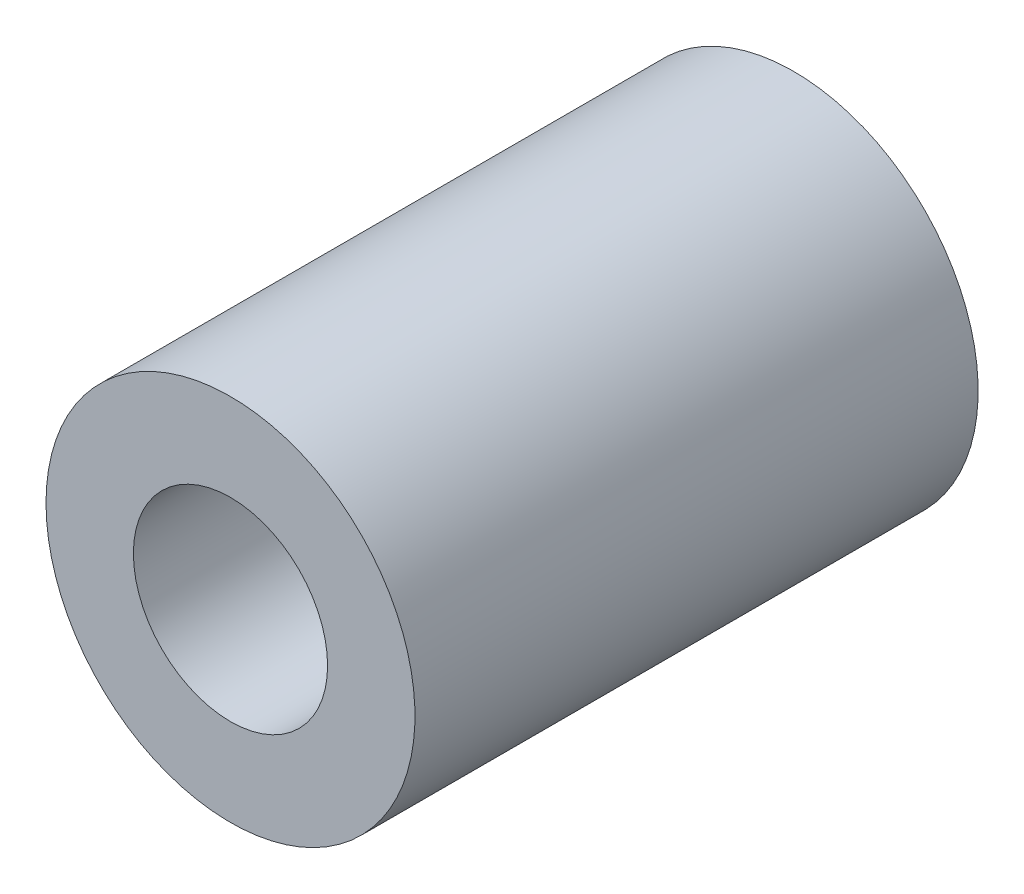
ISO-10303-21;
HEADER;
FILE_DESCRIPTION(('STEP AP214'),'2;1');
FILE_NAME('part.step','',(''),(''),'','','');
FILE_SCHEMA(('AUTOMOTIVE_DESIGN { 1 0 10303 214 1 1 1 1 }'));
ENDSEC;
DATA;
#1=APPLICATION_CONTEXT('core data for automotive mechanical design processes');
#2=APPLICATION_PROTOCOL_DEFINITION('international standard','automotive_design',2000,#1);
#3=PRODUCT_CONTEXT('',#1,'mechanical');
#4=PRODUCT('Part','Part','',(#3));
#5=PRODUCT_RELATED_PRODUCT_CATEGORY('part','',(#4));
#6=PRODUCT_DEFINITION_FORMATION('','',#4);
#7=PRODUCT_DEFINITION_CONTEXT('part definition',#1,'design');
#8=PRODUCT_DEFINITION('design','',#6,#7);
#9=PRODUCT_DEFINITION_SHAPE('','',#8);
#10=(LENGTH_UNIT() NAMED_UNIT(*) SI_UNIT(.MILLI.,.METRE.));
#11=(NAMED_UNIT(*) PLANE_ANGLE_UNIT() SI_UNIT($,.RADIAN.));
#12=(NAMED_UNIT(*) SI_UNIT($,.STERADIAN.) SOLID_ANGLE_UNIT());
#13=UNCERTAINTY_MEASURE_WITH_UNIT(LENGTH_MEASURE(1.E-05),#10,'distance_accuracy_value','');
#14=(GEOMETRIC_REPRESENTATION_CONTEXT(3) GLOBAL_UNCERTAINTY_ASSIGNED_CONTEXT((#13)) GLOBAL_UNIT_ASSIGNED_CONTEXT((#10,
#11,#12)) REPRESENTATION_CONTEXT('',''));
#15=CARTESIAN_POINT('',(0.,0.,0.));
#16=DIRECTION('',(0.,0.,1.));
#17=DIRECTION('',(1.,0.,0.));
#18=AXIS2_PLACEMENT_3D('',#15,#16,#17);
#19=CARTESIAN_POINT('',(0.,0.,29.));
#20=DIRECTION('',(0.,0.,1.));
#21=DIRECTION('',(1.,0.,0.));
#22=AXIS2_PLACEMENT_3D('',#19,#20,#21);
#23=PLANE('',#22);
#24=CARTESIAN_POINT('',(0.,0.,29.));
#25=DIRECTION('',(0.,0.,1.));
#26=DIRECTION('',(1.,0.,0.));
#27=AXIS2_PLACEMENT_3D('',#24,#25,#26);
#28=CIRCLE('',#27,9.5);
#29=CARTESIAN_POINT('',(-9.5,0.,29.));
#30=VERTEX_POINT('',#29);
#31=EDGE_CURVE('E10',#30,#30,#28,.T.);
#32=ORIENTED_EDGE('',*,*,#31,.T.);
#33=EDGE_LOOP('',(#32));
#34=FACE_BOUND('',#33,.T.);
#35=CARTESIAN_POINT('',(0.,0.,29.));
#36=DIRECTION('',(0.,0.,1.));
#37=DIRECTION('',(1.,0.,0.));
#38=AXIS2_PLACEMENT_3D('',#35,#36,#37);
#39=CIRCLE('',#38,5.);
#40=CARTESIAN_POINT('',(-5.,0.,29.));
#41=VERTEX_POINT('',#40);
#42=EDGE_CURVE('E44',#41,#41,#39,.T.);
#43=ORIENTED_EDGE('',*,*,#42,.F.);
#44=EDGE_LOOP('',(#43));
#45=FACE_BOUND('',#44,.T.);
#46=ADVANCED_FACE('F33',(#34,#45),#23,.T.);
#47=CARTESIAN_POINT('',(0.,0.,0.));
#48=DIRECTION('',(0.,0.,1.));
#49=DIRECTION('',(1.,0.,0.));
#50=AXIS2_PLACEMENT_3D('',#47,#48,#49);
#51=PLANE('',#50);
#52=CARTESIAN_POINT('',(0.,0.,0.));
#53=DIRECTION('',(0.,0.,1.));
#54=DIRECTION('',(1.,0.,0.));
#55=AXIS2_PLACEMENT_3D('',#52,#53,#54);
#56=CIRCLE('',#55,9.5);
#57=CARTESIAN_POINT('',(-9.5,0.,0.));
#58=VERTEX_POINT('',#57);
#59=EDGE_CURVE('E37',#58,#58,#56,.T.);
#60=ORIENTED_EDGE('',*,*,#59,.F.);
#61=EDGE_LOOP('',(#60));
#62=FACE_BOUND('',#61,.T.);
#63=CARTESIAN_POINT('',(0.,0.,0.));
#64=DIRECTION('',(0.,0.,1.));
#65=DIRECTION('',(1.,0.,0.));
#66=AXIS2_PLACEMENT_3D('',#63,#64,#65);
#67=CIRCLE('',#66,5.);
#68=CARTESIAN_POINT('',(-5.,0.,0.));
#69=VERTEX_POINT('',#68);
#70=EDGE_CURVE('E46',#69,#69,#67,.T.);
#71=ORIENTED_EDGE('',*,*,#70,.T.);
#72=EDGE_LOOP('',(#71));
#73=FACE_BOUND('',#72,.T.);
#74=ADVANCED_FACE('F56',(#62,#73),#51,.F.);
#75=CARTESIAN_POINT('',(0.,0.,29.));
#76=DIRECTION('',(0.,0.,-1.));
#77=DIRECTION('',(-1.,0.,0.));
#78=AXIS2_PLACEMENT_3D('',#75,#76,#77);
#79=CYLINDRICAL_SURFACE('',#78,9.5);
#80=CARTESIAN_POINT('',(-9.5,0.,29.));
#81=CARTESIAN_POINT('',(-9.5,0.,28.6979166666667));
#82=CARTESIAN_POINT('',(-9.5,0.,28.3958333333333));
#83=CARTESIAN_POINT('',(-9.5,0.,27.7916666666667));
#84=CARTESIAN_POINT('',(-9.5,0.,27.4895833333333));
#85=CARTESIAN_POINT('',(-9.5,0.,26.8854166666667));
#86=CARTESIAN_POINT('',(-9.5,0.,26.5833333333333));
#87=CARTESIAN_POINT('',(-9.5,0.,25.9791666666667));
#88=CARTESIAN_POINT('',(-9.5,0.,25.6770833333333));
#89=CARTESIAN_POINT('',(-9.5,0.,25.0729166666667));
#90=CARTESIAN_POINT('',(-9.5,0.,24.7708333333333));
#91=CARTESIAN_POINT('',(-9.5,0.,24.1666666666667));
#92=CARTESIAN_POINT('',(-9.5,0.,23.8645833333333));
#93=CARTESIAN_POINT('',(-9.5,0.,23.2604166666667));
#94=CARTESIAN_POINT('',(-9.5,0.,22.9583333333333));
#95=CARTESIAN_POINT('',(-9.5,0.,22.3541666666667));
#96=CARTESIAN_POINT('',(-9.5,0.,22.0520833333333));
#97=CARTESIAN_POINT('',(-9.5,0.,21.4479166666667));
#98=CARTESIAN_POINT('',(-9.5,0.,21.1458333333333));
#99=CARTESIAN_POINT('',(-9.5,0.,20.5416666666667));
#100=CARTESIAN_POINT('',(-9.5,0.,20.2395833333333));
#101=CARTESIAN_POINT('',(-9.5,0.,19.6354166666667));
#102=CARTESIAN_POINT('',(-9.5,0.,19.3333333333333));
#103=CARTESIAN_POINT('',(-9.5,0.,18.7291666666667));
#104=CARTESIAN_POINT('',(-9.5,0.,18.4270833333333));
#105=CARTESIAN_POINT('',(-9.5,0.,17.8229166666667));
#106=CARTESIAN_POINT('',(-9.5,0.,17.5208333333333));
#107=CARTESIAN_POINT('',(-9.5,0.,16.9166666666667));
#108=CARTESIAN_POINT('',(-9.5,0.,16.6145833333333));
#109=CARTESIAN_POINT('',(-9.5,0.,16.0104166666667));
#110=CARTESIAN_POINT('',(-9.5,0.,15.7083333333333));
#111=CARTESIAN_POINT('',(-9.5,0.,15.1041666666667));
#112=CARTESIAN_POINT('',(-9.5,0.,14.8020833333333));
#113=CARTESIAN_POINT('',(-9.5,0.,14.1979166666667));
#114=CARTESIAN_POINT('',(-9.5,0.,13.8958333333333));
#115=CARTESIAN_POINT('',(-9.5,0.,13.2916666666667));
#116=CARTESIAN_POINT('',(-9.5,0.,12.9895833333333));
#117=CARTESIAN_POINT('',(-9.5,0.,12.3854166666667));
#118=CARTESIAN_POINT('',(-9.5,0.,12.0833333333333));
#119=CARTESIAN_POINT('',(-9.5,0.,11.4791666666667));
#120=CARTESIAN_POINT('',(-9.5,0.,11.1770833333333));
#121=CARTESIAN_POINT('',(-9.5,0.,10.5729166666667));
#122=CARTESIAN_POINT('',(-9.5,0.,10.2708333333333));
#123=CARTESIAN_POINT('',(-9.5,0.,9.66666666666667));
#124=CARTESIAN_POINT('',(-9.5,0.,9.36458333333333));
#125=CARTESIAN_POINT('',(-9.5,0.,8.76041666666667));
#126=CARTESIAN_POINT('',(-9.5,0.,8.45833333333333));
#127=CARTESIAN_POINT('',(-9.5,0.,7.85416666666667));
#128=CARTESIAN_POINT('',(-9.5,0.,7.55208333333333));
#129=CARTESIAN_POINT('',(-9.5,0.,6.94791666666667));
#130=CARTESIAN_POINT('',(-9.5,0.,6.64583333333333));
#131=CARTESIAN_POINT('',(-9.5,0.,6.04166666666667));
#132=CARTESIAN_POINT('',(-9.5,0.,5.73958333333333));
#133=CARTESIAN_POINT('',(-9.5,0.,5.13541666666667));
#134=CARTESIAN_POINT('',(-9.5,0.,4.83333333333333));
#135=CARTESIAN_POINT('',(-9.5,0.,4.22916666666667));
#136=CARTESIAN_POINT('',(-9.5,0.,3.92708333333333));
#137=CARTESIAN_POINT('',(-9.5,0.,3.32291666666667));
#138=CARTESIAN_POINT('',(-9.5,0.,3.02083333333333));
#139=CARTESIAN_POINT('',(-9.5,0.,2.41666666666667));
#140=CARTESIAN_POINT('',(-9.5,0.,2.11458333333333));
#141=CARTESIAN_POINT('',(-9.5,0.,1.51041666666667));
#142=CARTESIAN_POINT('',(-9.5,0.,1.20833333333333));
#143=CARTESIAN_POINT('',(-9.5,0.,0.604166666666667));
#144=CARTESIAN_POINT('',(-9.5,0.,0.302083333333333));
#145=CARTESIAN_POINT('',(-9.5,0.,0.));
#146=B_SPLINE_CURVE_WITH_KNOTS('',3,(#80,#81,#82,#83,#84,#85,#86,#87,#88,#89,#90,#91,#92,#93,
#94,#95,#96,#97,#98,#99,#100,#101,#102,#103,#104,#105,#106,#107,#108,#109,#110,#111,#112,#113,
#114,#115,#116,#117,#118,#119,#120,#121,#122,#123,#124,#125,#126,#127,#128,#129,#130,#131,#132,
#133,#134,#135,#136,#137,#138,#139,#140,#141,#142,#143,#144,#145),.UNSPECIFIED.,.F.,.F.,(4,2,2,
2,2,2,2,2,2,2,2,2,2,2,2,2,2,2,2,2,2,2,2,2,2,2,2,2,2,2,2,2,4),(0.,0.906250000000001,1.8125,
2.71875,3.625,4.53125,5.4375,6.34375,7.25,8.15625,9.0625,9.96875,10.875,11.78125,12.6875,
13.59375,14.5,15.40625,16.3125,17.21875,18.125,19.03125,19.9375,20.84375,21.75,22.65625,23.5625,
24.46875,25.375,26.28125,27.1875,28.09375,29.),.UNSPECIFIED.);
#147=EDGE_CURVE('BSEAM35',#30,#58,#146,.T.);
#148=ORIENTED_EDGE('',*,*,#31,.F.);
#149=ORIENTED_EDGE('',*,*,#59,.T.);
#150=ORIENTED_EDGE('',*,*,#147,.T.);
#151=ORIENTED_EDGE('',*,*,#147,.F.);
#152=EDGE_LOOP('',(#148,#150,#149,#151));
#153=FACE_BOUND('',#152,.T.);
#154=ADVANCED_FACE('F35',(#153),#79,.T.);
#155=CARTESIAN_POINT('',(0.,0.,29.));
#156=DIRECTION('',(0.,0.,-1.));
#157=DIRECTION('',(-1.,0.,0.));
#158=AXIS2_PLACEMENT_3D('',#155,#156,#157);
#159=CYLINDRICAL_SURFACE('',#158,5.);
#160=CARTESIAN_POINT('',(-5.,0.,29.));
#161=CARTESIAN_POINT('',(-5.,0.,28.6979166666667));
#162=CARTESIAN_POINT('',(-5.,0.,28.3958333333333));
#163=CARTESIAN_POINT('',(-5.,0.,27.7916666666667));
#164=CARTESIAN_POINT('',(-5.,0.,27.4895833333333));
#165=CARTESIAN_POINT('',(-5.,0.,26.8854166666667));
#166=CARTESIAN_POINT('',(-5.,0.,26.5833333333333));
#167=CARTESIAN_POINT('',(-5.,0.,25.9791666666667));
#168=CARTESIAN_POINT('',(-5.,0.,25.6770833333333));
#169=CARTESIAN_POINT('',(-5.,0.,25.0729166666667));
#170=CARTESIAN_POINT('',(-5.,0.,24.7708333333333));
#171=CARTESIAN_POINT('',(-5.,0.,24.1666666666667));
#172=CARTESIAN_POINT('',(-5.,0.,23.8645833333333));
#173=CARTESIAN_POINT('',(-5.,0.,23.2604166666667));
#174=CARTESIAN_POINT('',(-5.,0.,22.9583333333333));
#175=CARTESIAN_POINT('',(-5.,0.,22.3541666666667));
#176=CARTESIAN_POINT('',(-5.,0.,22.0520833333333));
#177=CARTESIAN_POINT('',(-5.,0.,21.4479166666667));
#178=CARTESIAN_POINT('',(-5.,0.,21.1458333333333));
#179=CARTESIAN_POINT('',(-5.,0.,20.5416666666667));
#180=CARTESIAN_POINT('',(-5.,0.,20.2395833333333));
#181=CARTESIAN_POINT('',(-5.,0.,19.6354166666667));
#182=CARTESIAN_POINT('',(-5.,0.,19.3333333333333));
#183=CARTESIAN_POINT('',(-5.,0.,18.7291666666667));
#184=CARTESIAN_POINT('',(-5.,0.,18.4270833333333));
#185=CARTESIAN_POINT('',(-5.,0.,17.8229166666667));
#186=CARTESIAN_POINT('',(-5.,0.,17.5208333333333));
#187=CARTESIAN_POINT('',(-5.,0.,16.9166666666667));
#188=CARTESIAN_POINT('',(-5.,0.,16.6145833333333));
#189=CARTESIAN_POINT('',(-5.,0.,16.0104166666667));
#190=CARTESIAN_POINT('',(-5.,0.,15.7083333333333));
#191=CARTESIAN_POINT('',(-5.,0.,15.1041666666667));
#192=CARTESIAN_POINT('',(-5.,0.,14.8020833333333));
#193=CARTESIAN_POINT('',(-5.,0.,14.1979166666667));
#194=CARTESIAN_POINT('',(-5.,0.,13.8958333333333));
#195=CARTESIAN_POINT('',(-5.,0.,13.2916666666667));
#196=CARTESIAN_POINT('',(-5.,0.,12.9895833333333));
#197=CARTESIAN_POINT('',(-5.,0.,12.3854166666667));
#198=CARTESIAN_POINT('',(-5.,0.,12.0833333333333));
#199=CARTESIAN_POINT('',(-5.,0.,11.4791666666667));
#200=CARTESIAN_POINT('',(-5.,0.,11.1770833333333));
#201=CARTESIAN_POINT('',(-5.,0.,10.5729166666667));
#202=CARTESIAN_POINT('',(-5.,0.,10.2708333333333));
#203=CARTESIAN_POINT('',(-5.,0.,9.66666666666667));
#204=CARTESIAN_POINT('',(-5.,0.,9.36458333333333));
#205=CARTESIAN_POINT('',(-5.,0.,8.76041666666667));
#206=CARTESIAN_POINT('',(-5.,0.,8.45833333333333));
#207=CARTESIAN_POINT('',(-5.,0.,7.85416666666667));
#208=CARTESIAN_POINT('',(-5.,0.,7.55208333333333));
#209=CARTESIAN_POINT('',(-5.,0.,6.94791666666667));
#210=CARTESIAN_POINT('',(-5.,0.,6.64583333333333));
#211=CARTESIAN_POINT('',(-5.,0.,6.04166666666667));
#212=CARTESIAN_POINT('',(-5.,0.,5.73958333333333));
#213=CARTESIAN_POINT('',(-5.,0.,5.13541666666667));
#214=CARTESIAN_POINT('',(-5.,0.,4.83333333333333));
#215=CARTESIAN_POINT('',(-5.,0.,4.22916666666667));
#216=CARTESIAN_POINT('',(-5.,0.,3.92708333333333));
#217=CARTESIAN_POINT('',(-5.,0.,3.32291666666667));
#218=CARTESIAN_POINT('',(-5.,0.,3.02083333333333));
#219=CARTESIAN_POINT('',(-5.,0.,2.41666666666667));
#220=CARTESIAN_POINT('',(-5.,0.,2.11458333333333));
#221=CARTESIAN_POINT('',(-5.,0.,1.51041666666667));
#222=CARTESIAN_POINT('',(-5.,0.,1.20833333333333));
#223=CARTESIAN_POINT('',(-5.,0.,0.604166666666667));
#224=CARTESIAN_POINT('',(-5.,0.,0.302083333333333));
#225=CARTESIAN_POINT('',(-5.,0.,0.));
#226=B_SPLINE_CURVE_WITH_KNOTS('',3,(#160,#161,#162,#163,#164,#165,#166,#167,#168,#169,#170,
#171,#172,#173,#174,#175,#176,#177,#178,#179,#180,#181,#182,#183,#184,#185,#186,#187,#188,#189,
#190,#191,#192,#193,#194,#195,#196,#197,#198,#199,#200,#201,#202,#203,#204,#205,#206,#207,#208,
#209,#210,#211,#212,#213,#214,#215,#216,#217,#218,#219,#220,#221,#222,#223,#224,#225),
.UNSPECIFIED.,.F.,.F.,(4,2,2,2,2,2,2,2,2,2,2,2,2,2,2,2,2,2,2,2,2,2,2,2,2,2,2,2,2,2,2,2,4),(0.,
0.906249999999997,1.8125,2.71875,3.625,4.53125,5.4375,6.34375,7.25,8.15625,9.0625,9.96875,
10.875,11.78125,12.6875,13.59375,14.5,15.40625,16.3125,17.21875,18.125,19.03125,19.9375,
20.84375,21.75,22.65625,23.5625,24.46875,25.375,26.28125,27.1875,28.09375,29.),.UNSPECIFIED.);
#227=EDGE_CURVE('BSEAM52',#41,#69,#226,.T.);
#228=ORIENTED_EDGE('',*,*,#42,.T.);
#229=ORIENTED_EDGE('',*,*,#70,.F.);
#230=ORIENTED_EDGE('',*,*,#227,.T.);
#231=ORIENTED_EDGE('',*,*,#227,.F.);
#232=EDGE_LOOP('',(#228,#230,#229,#231));
#233=FACE_BOUND('',#232,.T.);
#234=ADVANCED_FACE('F52',(#233),#159,.F.);
#235=CLOSED_SHELL('',(#46,#74,#154,#234));
#236=MANIFOLD_SOLID_BREP('B2',#235);
#237=ADVANCED_BREP_SHAPE_REPRESENTATION('',(#18,#236),#14);
#238=SHAPE_DEFINITION_REPRESENTATION(#9,#237);
ENDSEC;
END-ISO-10303-21;
